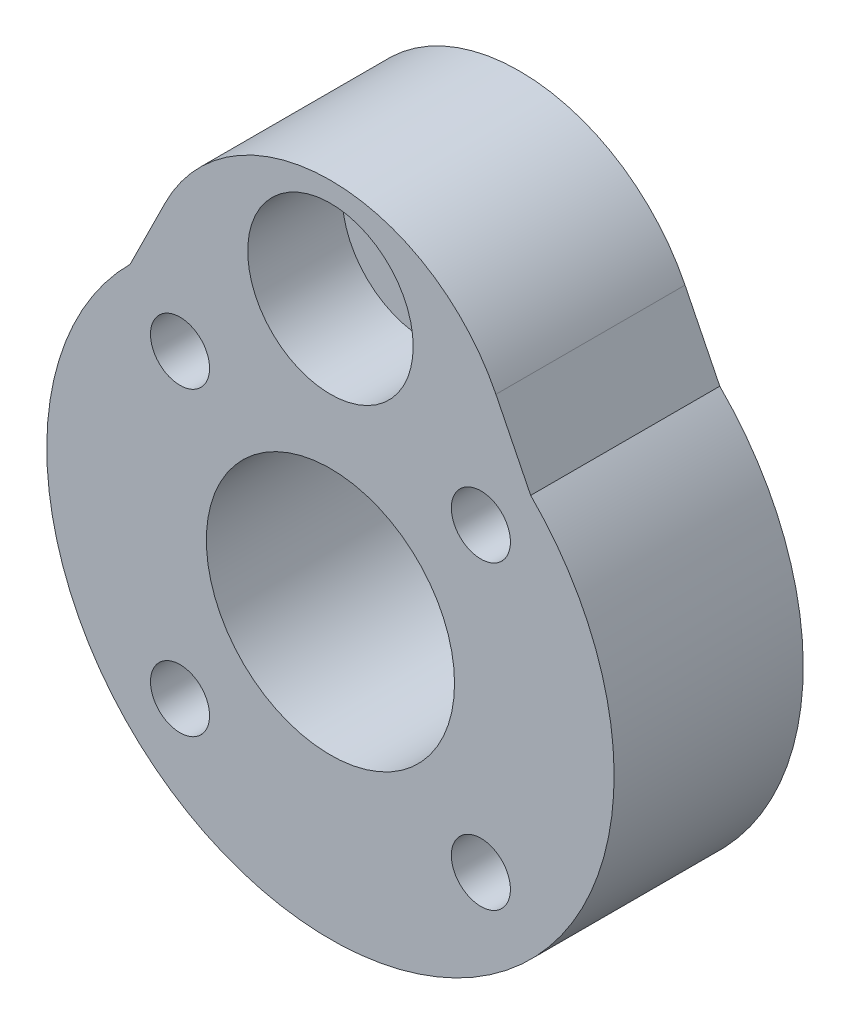
ISO-10303-21;
HEADER;
FILE_DESCRIPTION(('STEP AP214'),'2;1');
FILE_NAME('part.step','',(''),(''),'','','');
FILE_SCHEMA(('AUTOMOTIVE_DESIGN { 1 0 10303 214 1 1 1 1 }'));
ENDSEC;
DATA;
#1=APPLICATION_CONTEXT('core data for automotive mechanical design processes');
#2=APPLICATION_PROTOCOL_DEFINITION('international standard','automotive_design',2000,#1);
#3=PRODUCT_CONTEXT('',#1,'mechanical');
#4=PRODUCT('Part','Part','',(#3));
#5=PRODUCT_RELATED_PRODUCT_CATEGORY('part','',(#4));
#6=PRODUCT_DEFINITION_FORMATION('','',#4);
#7=PRODUCT_DEFINITION_CONTEXT('part definition',#1,'design');
#8=PRODUCT_DEFINITION('design','',#6,#7);
#9=PRODUCT_DEFINITION_SHAPE('','',#8);
#10=(LENGTH_UNIT() NAMED_UNIT(*) SI_UNIT(.MILLI.,.METRE.));
#11=(NAMED_UNIT(*) PLANE_ANGLE_UNIT() SI_UNIT($,.RADIAN.));
#12=(NAMED_UNIT(*) SI_UNIT($,.STERADIAN.) SOLID_ANGLE_UNIT());
#13=UNCERTAINTY_MEASURE_WITH_UNIT(LENGTH_MEASURE(1.E-05),#10,'distance_accuracy_value','');
#14=(GEOMETRIC_REPRESENTATION_CONTEXT(3) GLOBAL_UNCERTAINTY_ASSIGNED_CONTEXT((#13)) GLOBAL_UNIT_ASSIGNED_CONTEXT((#10,
#11,#12)) REPRESENTATION_CONTEXT('',''));
#15=CARTESIAN_POINT('',(0.,0.,0.));
#16=DIRECTION('',(0.,0.,1.));
#17=DIRECTION('',(1.,0.,0.));
#18=AXIS2_PLACEMENT_3D('',#15,#16,#17);
#19=CARTESIAN_POINT('',(0.,11.4681143875476,0.));
#20=DIRECTION('',(0.,0.,1.));
#21=DIRECTION('',(1.,0.,0.));
#22=AXIS2_PLACEMENT_3D('',#19,#20,#21);
#23=CYLINDRICAL_SURFACE('',#22,2.00000000000001);
#24=CARTESIAN_POINT('',(0.,11.4681143875476,0.));
#25=DIRECTION('',(0.,0.,1.));
#26=DIRECTION('',(1.,0.,0.));
#27=AXIS2_PLACEMENT_3D('',#24,#25,#26);
#28=CIRCLE('',#27,2.00000000000001);
#29=CARTESIAN_POINT('',(2.00000000000001,11.4681143875476,0.));
#30=VERTEX_POINT('',#29);
#31=EDGE_CURVE('E258',#30,#30,#28,.T.);
#32=ORIENTED_EDGE('',*,*,#31,.F.);
#33=EDGE_LOOP('',(#32));
#34=FACE_BOUND('',#33,.T.);
#35=CARTESIAN_POINT('',(0.,11.4681143875476,4.));
#36=DIRECTION('',(0.,0.,1.));
#37=DIRECTION('',(1.,0.,0.));
#38=AXIS2_PLACEMENT_3D('',#35,#36,#37);
#39=CIRCLE('',#38,2.00000000000001);
#40=CARTESIAN_POINT('',(2.00000000000001,11.4681143875476,4.));
#41=VERTEX_POINT('',#40);
#42=EDGE_CURVE('E37',#41,#41,#39,.F.);
#43=ORIENTED_EDGE('',*,*,#42,.F.);
#44=EDGE_LOOP('',(#43));
#45=FACE_BOUND('',#44,.T.);
#46=ADVANCED_FACE('F33',(#34,#45),#23,.F.);
#47=CARTESIAN_POINT('',(0.,0.,8.));
#48=DIRECTION('',(0.,0.,1.));
#49=DIRECTION('',(1.,0.,0.));
#50=AXIS2_PLACEMENT_3D('',#47,#48,#49);
#51=PLANE('',#50);
#52=CARTESIAN_POINT('',(0.,11.4681143875476,8.));
#53=DIRECTION('',(0.,0.,1.));
#54=DIRECTION('',(1.,0.,0.));
#55=AXIS2_PLACEMENT_3D('',#52,#53,#54);
#56=CIRCLE('',#55,3.5);
#57=CARTESIAN_POINT('',(3.5,11.4681143875476,8.));
#58=VERTEX_POINT('',#57);
#59=EDGE_CURVE('E291',#58,#58,#56,.T.);
#60=ORIENTED_EDGE('',*,*,#59,.F.);
#61=EDGE_LOOP('',(#60));
#62=FACE_BOUND('',#61,.T.);
#63=CARTESIAN_POINT('',(6.36396103067894,6.36396103067892,8.));
#64=DIRECTION('',(0.,0.,1.));
#65=DIRECTION('',(1.,0.,0.));
#66=AXIS2_PLACEMENT_3D('',#63,#64,#65);
#67=CIRCLE('',#66,1.25);
#68=CARTESIAN_POINT('',(7.61396103067894,6.36396103067892,8.));
#69=VERTEX_POINT('',#68);
#70=EDGE_CURVE('E286',#69,#69,#67,.T.);
#71=ORIENTED_EDGE('',*,*,#70,.F.);
#72=EDGE_LOOP('',(#71));
#73=FACE_BOUND('',#72,.T.);
#74=CARTESIAN_POINT('',(6.36396103067892,-6.36396103067894,8.));
#75=DIRECTION('',(0.,0.,1.));
#76=DIRECTION('',(1.,0.,0.));
#77=AXIS2_PLACEMENT_3D('',#74,#75,#76);
#78=CIRCLE('',#77,1.25);
#79=CARTESIAN_POINT('',(7.61396103067892,-6.36396103067894,8.));
#80=VERTEX_POINT('',#79);
#81=EDGE_CURVE('E282',#80,#80,#78,.T.);
#82=ORIENTED_EDGE('',*,*,#81,.F.);
#83=EDGE_LOOP('',(#82));
#84=FACE_BOUND('',#83,.T.);
#85=CARTESIAN_POINT('',(-6.36396103067894,-6.36396103067892,8.));
#86=DIRECTION('',(0.,0.,1.));
#87=DIRECTION('',(1.,0.,0.));
#88=AXIS2_PLACEMENT_3D('',#85,#86,#87);
#89=CIRCLE('',#88,1.25);
#90=CARTESIAN_POINT('',(-5.11396103067894,-6.36396103067892,8.));
#91=VERTEX_POINT('',#90);
#92=EDGE_CURVE('E278',#91,#91,#89,.T.);
#93=ORIENTED_EDGE('',*,*,#92,.F.);
#94=EDGE_LOOP('',(#93));
#95=FACE_BOUND('',#94,.T.);
#96=CARTESIAN_POINT('',(-6.36396103067892,6.36396103067894,8.));
#97=DIRECTION('',(0.,0.,1.));
#98=DIRECTION('',(1.,0.,0.));
#99=AXIS2_PLACEMENT_3D('',#96,#97,#98);
#100=CIRCLE('',#99,1.25);
#101=CARTESIAN_POINT('',(-5.11396103067892,6.36396103067894,8.));
#102=VERTEX_POINT('',#101);
#103=EDGE_CURVE('E97',#102,#102,#100,.T.);
#104=ORIENTED_EDGE('',*,*,#103,.F.);
#105=EDGE_LOOP('',(#104));
#106=FACE_BOUND('',#105,.T.);
#107=CARTESIAN_POINT('',(0.,0.,8.));
#108=DIRECTION('',(0.,0.,1.));
#109=DIRECTION('',(1.,0.,0.));
#110=AXIS2_PLACEMENT_3D('',#107,#108,#109);
#111=CIRCLE('',#110,12.);
#112=CARTESIAN_POINT('',(-8.47053717304872,8.49999999999999,8.));
#113=VERTEX_POINT('',#112);
#114=CARTESIAN_POINT('',(8.47053717304871,8.5,8.));
#115=VERTEX_POINT('',#114);
#116=EDGE_CURVE('E11',#113,#115,#111,.T.);
#117=ORIENTED_EDGE('',*,*,#116,.T.);
#118=DIRECTION('',(-0.44394533232071,0.896053872214531,0.));
#119=VECTOR('',#118,1.);
#120=CARTESIAN_POINT('',(7.,11.4681143875476,8.));
#121=LINE('',#120,#119);
#122=CARTESIAN_POINT('',(7.,11.4681143875476,8.));
#123=VERTEX_POINT('',#122);
#124=EDGE_CURVE('E84',#115,#123,#121,.T.);
#125=ORIENTED_EDGE('',*,*,#124,.T.);
#126=CARTESIAN_POINT('',(0.,8.,8.));
#127=DIRECTION('',(0.,0.,1.));
#128=DIRECTION('',(-1.,0.,0.));
#129=AXIS2_PLACEMENT_3D('',#126,#127,#128);
#130=CIRCLE('',#129,7.81203029980778);
#131=CARTESIAN_POINT('',(-7.,11.4681143875476,8.));
#132=VERTEX_POINT('',#131);
#133=EDGE_CURVE('E78',#123,#132,#130,.T.);
#134=ORIENTED_EDGE('',*,*,#133,.T.);
#135=DIRECTION('',(-0.44394533232071,-0.896053872214531,0.));
#136=VECTOR('',#135,1.);
#137=CARTESIAN_POINT('',(-7.,11.4681143875476,8.));
#138=LINE('',#137,#136);
#139=EDGE_CURVE('E87',#132,#113,#138,.T.);
#140=ORIENTED_EDGE('',*,*,#139,.T.);
#141=EDGE_LOOP('',(#117,#125,#134,#140));
#142=FACE_BOUND('',#141,.T.);
#143=CARTESIAN_POINT('',(0.,0.,8.));
#144=DIRECTION('',(0.,0.,1.));
#145=DIRECTION('',(1.,0.,0.));
#146=AXIS2_PLACEMENT_3D('',#143,#144,#145);
#147=CIRCLE('',#146,5.25);
#148=CARTESIAN_POINT('',(5.25,0.,8.));
#149=VERTEX_POINT('',#148);
#150=EDGE_CURVE('E112',#149,#149,#147,.T.);
#151=ORIENTED_EDGE('',*,*,#150,.F.);
#152=EDGE_LOOP('',(#151));
#153=FACE_BOUND('',#152,.T.);
#154=ADVANCED_FACE('F91',(#62,#73,#84,#95,#106,#142,#153),#51,.T.);
#155=CARTESIAN_POINT('',(0.,0.,0.));
#156=DIRECTION('',(0.,0.,1.));
#157=DIRECTION('',(1.,0.,0.));
#158=AXIS2_PLACEMENT_3D('',#155,#156,#157);
#159=PLANE('',#158);
#160=ORIENTED_EDGE('',*,*,#31,.T.);
#161=EDGE_LOOP('',(#160));
#162=FACE_BOUND('',#161,.T.);
#163=CARTESIAN_POINT('',(6.36396103067894,6.36396103067892,0.));
#164=DIRECTION('',(0.,0.,1.));
#165=DIRECTION('',(1.,0.,0.));
#166=AXIS2_PLACEMENT_3D('',#163,#164,#165);
#167=CIRCLE('',#166,1.25);
#168=CARTESIAN_POINT('',(7.61396103067894,6.36396103067892,0.));
#169=VERTEX_POINT('',#168);
#170=EDGE_CURVE('E262',#169,#169,#167,.T.);
#171=ORIENTED_EDGE('',*,*,#170,.T.);
#172=EDGE_LOOP('',(#171));
#173=FACE_BOUND('',#172,.T.);
#174=CARTESIAN_POINT('',(6.36396103067892,-6.36396103067894,0.));
#175=DIRECTION('',(0.,0.,1.));
#176=DIRECTION('',(1.,0.,0.));
#177=AXIS2_PLACEMENT_3D('',#174,#175,#176);
#178=CIRCLE('',#177,1.25);
#179=CARTESIAN_POINT('',(7.61396103067892,-6.36396103067894,0.));
#180=VERTEX_POINT('',#179);
#181=EDGE_CURVE('E266',#180,#180,#178,.T.);
#182=ORIENTED_EDGE('',*,*,#181,.T.);
#183=EDGE_LOOP('',(#182));
#184=FACE_BOUND('',#183,.T.);
#185=CARTESIAN_POINT('',(-6.36396103067894,-6.36396103067892,0.));
#186=DIRECTION('',(0.,0.,1.));
#187=DIRECTION('',(1.,0.,0.));
#188=AXIS2_PLACEMENT_3D('',#185,#186,#187);
#189=CIRCLE('',#188,1.25);
#190=CARTESIAN_POINT('',(-5.11396103067894,-6.36396103067892,0.));
#191=VERTEX_POINT('',#190);
#192=EDGE_CURVE('E270',#191,#191,#189,.T.);
#193=ORIENTED_EDGE('',*,*,#192,.T.);
#194=EDGE_LOOP('',(#193));
#195=FACE_BOUND('',#194,.T.);
#196=CARTESIAN_POINT('',(-6.36396103067892,6.36396103067894,0.));
#197=DIRECTION('',(0.,0.,1.));
#198=DIRECTION('',(1.,0.,0.));
#199=AXIS2_PLACEMENT_3D('',#196,#197,#198);
#200=CIRCLE('',#199,1.25);
#201=CARTESIAN_POINT('',(-5.11396103067892,6.36396103067894,0.));
#202=VERTEX_POINT('',#201);
#203=EDGE_CURVE('E94',#202,#202,#200,.T.);
#204=ORIENTED_EDGE('',*,*,#203,.T.);
#205=EDGE_LOOP('',(#204));
#206=FACE_BOUND('',#205,.T.);
#207=CARTESIAN_POINT('',(0.,0.,0.));
#208=DIRECTION('',(0.,0.,1.));
#209=DIRECTION('',(1.,0.,0.));
#210=AXIS2_PLACEMENT_3D('',#207,#208,#209);
#211=CIRCLE('',#210,12.);
#212=CARTESIAN_POINT('',(-8.47053717304871,8.5,0.));
#213=VERTEX_POINT('',#212);
#214=CARTESIAN_POINT('',(8.47053717304871,8.5,0.));
#215=VERTEX_POINT('',#214);
#216=EDGE_CURVE('E42',#213,#215,#211,.T.);
#217=ORIENTED_EDGE('',*,*,#216,.F.);
#218=DIRECTION('',(0.44394533232071,0.896053872214531,0.));
#219=VECTOR('',#218,1.);
#220=CARTESIAN_POINT('',(-7.,11.4681143875476,0.));
#221=LINE('',#220,#219);
#222=CARTESIAN_POINT('',(-7.,11.4681143875476,0.));
#223=VERTEX_POINT('',#222);
#224=EDGE_CURVE('E109',#213,#223,#221,.T.);
#225=ORIENTED_EDGE('',*,*,#224,.T.);
#226=CARTESIAN_POINT('',(0.,8.,0.));
#227=DIRECTION('',(0.,0.,1.));
#228=DIRECTION('',(1.,0.,0.));
#229=AXIS2_PLACEMENT_3D('',#226,#227,#228);
#230=CIRCLE('',#229,7.81203029980778);
#231=CARTESIAN_POINT('',(7.,11.4681143875476,0.));
#232=VERTEX_POINT('',#231);
#233=EDGE_CURVE('E80',#223,#232,#230,.F.);
#234=ORIENTED_EDGE('',*,*,#233,.T.);
#235=DIRECTION('',(0.44394533232071,-0.896053872214531,0.));
#236=VECTOR('',#235,1.);
#237=CARTESIAN_POINT('',(7.,11.4681143875476,0.));
#238=LINE('',#237,#236);
#239=EDGE_CURVE('E105',#232,#215,#238,.T.);
#240=ORIENTED_EDGE('',*,*,#239,.T.);
#241=EDGE_LOOP('',(#217,#225,#234,#240));
#242=FACE_BOUND('',#241,.T.);
#243=CARTESIAN_POINT('',(0.,0.,0.));
#244=DIRECTION('',(0.,0.,1.));
#245=DIRECTION('',(1.,0.,0.));
#246=AXIS2_PLACEMENT_3D('',#243,#244,#245);
#247=CIRCLE('',#246,5.25);
#248=CARTESIAN_POINT('',(5.25,0.,0.));
#249=VERTEX_POINT('',#248);
#250=EDGE_CURVE('E111',#249,#249,#247,.T.);
#251=ORIENTED_EDGE('',*,*,#250,.T.);
#252=EDGE_LOOP('',(#251));
#253=FACE_BOUND('',#252,.T.);
#254=ADVANCED_FACE('F118',(#162,#173,#184,#195,#206,#242,#253),#159,.F.);
#255=CARTESIAN_POINT('',(0.,0.,8.));
#256=DIRECTION('',(0.,0.,-1.));
#257=DIRECTION('',(-1.,0.,0.));
#258=AXIS2_PLACEMENT_3D('',#255,#256,#257);
#259=CYLINDRICAL_SURFACE('',#258,12.);
#260=ORIENTED_EDGE('',*,*,#216,.T.);
#261=DIRECTION('',(0.,0.,1.));
#262=VECTOR('',#261,1.);
#263=CARTESIAN_POINT('',(8.47053717304871,8.5,-18.4517150179951));
#264=LINE('',#263,#262);
#265=EDGE_CURVE('E106',#215,#115,#264,.T.);
#266=ORIENTED_EDGE('',*,*,#265,.T.);
#267=ORIENTED_EDGE('',*,*,#116,.F.);
#268=DIRECTION('',(0.,0.,1.));
#269=VECTOR('',#268,1.);
#270=CARTESIAN_POINT('',(-8.47053717304871,8.5,-18.4517150179951));
#271=LINE('',#270,#269);
#272=EDGE_CURVE('E83',#213,#113,#271,.T.);
#273=ORIENTED_EDGE('',*,*,#272,.F.);
#274=EDGE_LOOP('',(#260,#266,#267,#273));
#275=FACE_BOUND('',#274,.T.);
#276=ADVANCED_FACE('F35',(#275),#259,.T.);
#277=CARTESIAN_POINT('',(0.,0.,8.));
#278=DIRECTION('',(0.,0.,-1.));
#279=DIRECTION('',(-1.,0.,0.));
#280=AXIS2_PLACEMENT_3D('',#277,#278,#279);
#281=CYLINDRICAL_SURFACE('',#280,5.25);
#282=ORIENTED_EDGE('',*,*,#150,.T.);
#283=EDGE_LOOP('',(#282));
#284=FACE_BOUND('',#283,.T.);
#285=ORIENTED_EDGE('',*,*,#250,.F.);
#286=EDGE_LOOP('',(#285));
#287=FACE_BOUND('',#286,.T.);
#288=ADVANCED_FACE('F120',(#284,#287),#281,.F.);
#289=CARTESIAN_POINT('',(0.,8.,-18.4517150179951));
#290=DIRECTION('',(0.,0.,1.));
#291=DIRECTION('',(1.,0.,0.));
#292=AXIS2_PLACEMENT_3D('',#289,#290,#291);
#293=CYLINDRICAL_SURFACE('',#292,7.81203029980778);
#294=ORIENTED_EDGE('',*,*,#233,.F.);
#295=DIRECTION('',(0.,0.,1.));
#296=VECTOR('',#295,1.);
#297=CARTESIAN_POINT('',(-7.,11.4681143875476,-18.4517150179951));
#298=LINE('',#297,#296);
#299=EDGE_CURVE('E73',#223,#132,#298,.T.);
#300=ORIENTED_EDGE('',*,*,#299,.T.);
#301=ORIENTED_EDGE('',*,*,#133,.F.);
#302=DIRECTION('',(0.,0.,1.));
#303=VECTOR('',#302,1.);
#304=CARTESIAN_POINT('',(7.,11.4681143875476,-18.4517150179951));
#305=LINE('',#304,#303);
#306=EDGE_CURVE('E103',#232,#123,#305,.T.);
#307=ORIENTED_EDGE('',*,*,#306,.F.);
#308=EDGE_LOOP('',(#294,#300,#301,#307));
#309=FACE_BOUND('',#308,.T.);
#310=ADVANCED_FACE('F75',(#309),#293,.T.);
#311=CARTESIAN_POINT('',(7.,11.4681143875476,-18.4517150179951));
#312=DIRECTION('',(0.896053872214531,0.44394533232071,0.));
#313=DIRECTION('',(-0.44394533232071,0.896053872214531,0.));
#314=AXIS2_PLACEMENT_3D('',#311,#312,#313);
#315=PLANE('',#314);
#316=ORIENTED_EDGE('',*,*,#239,.F.);
#317=ORIENTED_EDGE('',*,*,#306,.T.);
#318=ORIENTED_EDGE('',*,*,#124,.F.);
#319=ORIENTED_EDGE('',*,*,#265,.F.);
#320=EDGE_LOOP('',(#316,#317,#318,#319));
#321=FACE_BOUND('',#320,.T.);
#322=ADVANCED_FACE('F128',(#321),#315,.T.);
#323=CARTESIAN_POINT('',(-7.,11.4681143875476,-18.4517150179951));
#324=DIRECTION('',(-0.896053872214531,0.44394533232071,0.));
#325=DIRECTION('',(-0.44394533232071,-0.896053872214531,0.));
#326=AXIS2_PLACEMENT_3D('',#323,#324,#325);
#327=PLANE('',#326);
#328=ORIENTED_EDGE('',*,*,#224,.F.);
#329=ORIENTED_EDGE('',*,*,#272,.T.);
#330=ORIENTED_EDGE('',*,*,#139,.F.);
#331=ORIENTED_EDGE('',*,*,#299,.F.);
#332=EDGE_LOOP('',(#328,#329,#330,#331));
#333=FACE_BOUND('',#332,.T.);
#334=ADVANCED_FACE('F88',(#333),#327,.T.);
#335=CARTESIAN_POINT('',(-6.36396103067892,6.36396103067894,0.));
#336=DIRECTION('',(0.,0.,1.));
#337=DIRECTION('',(1.,0.,0.));
#338=AXIS2_PLACEMENT_3D('',#335,#336,#337);
#339=CYLINDRICAL_SURFACE('',#338,1.25);
#340=ORIENTED_EDGE('',*,*,#203,.F.);
#341=EDGE_LOOP('',(#340));
#342=FACE_BOUND('',#341,.T.);
#343=ORIENTED_EDGE('',*,*,#103,.T.);
#344=EDGE_LOOP('',(#343));
#345=FACE_BOUND('',#344,.T.);
#346=ADVANCED_FACE('F156',(#342,#345),#339,.F.);
#347=CARTESIAN_POINT('',(-6.36396103067894,-6.36396103067892,0.));
#348=DIRECTION('',(0.,0.,1.));
#349=DIRECTION('',(1.,0.,0.));
#350=AXIS2_PLACEMENT_3D('',#347,#348,#349);
#351=CYLINDRICAL_SURFACE('',#350,1.25);
#352=ORIENTED_EDGE('',*,*,#192,.F.);
#353=EDGE_LOOP('',(#352));
#354=FACE_BOUND('',#353,.T.);
#355=ORIENTED_EDGE('',*,*,#92,.T.);
#356=EDGE_LOOP('',(#355));
#357=FACE_BOUND('',#356,.T.);
#358=ADVANCED_FACE('F152',(#354,#357),#351,.F.);
#359=CARTESIAN_POINT('',(6.36396103067892,-6.36396103067894,0.));
#360=DIRECTION('',(0.,0.,1.));
#361=DIRECTION('',(1.,0.,0.));
#362=AXIS2_PLACEMENT_3D('',#359,#360,#361);
#363=CYLINDRICAL_SURFACE('',#362,1.25);
#364=ORIENTED_EDGE('',*,*,#181,.F.);
#365=EDGE_LOOP('',(#364));
#366=FACE_BOUND('',#365,.T.);
#367=ORIENTED_EDGE('',*,*,#81,.T.);
#368=EDGE_LOOP('',(#367));
#369=FACE_BOUND('',#368,.T.);
#370=ADVANCED_FACE('F148',(#366,#369),#363,.F.);
#371=CARTESIAN_POINT('',(6.36396103067894,6.36396103067892,0.));
#372=DIRECTION('',(0.,0.,1.));
#373=DIRECTION('',(1.,0.,0.));
#374=AXIS2_PLACEMENT_3D('',#371,#372,#373);
#375=CYLINDRICAL_SURFACE('',#374,1.25);
#376=ORIENTED_EDGE('',*,*,#170,.F.);
#377=EDGE_LOOP('',(#376));
#378=FACE_BOUND('',#377,.T.);
#379=ORIENTED_EDGE('',*,*,#70,.T.);
#380=EDGE_LOOP('',(#379));
#381=FACE_BOUND('',#380,.T.);
#382=ADVANCED_FACE('F144',(#378,#381),#375,.F.);
#383=CARTESIAN_POINT('',(0.,11.4681143875476,4.));
#384=DIRECTION('',(0.,0.,1.));
#385=DIRECTION('',(1.,0.,0.));
#386=AXIS2_PLACEMENT_3D('',#383,#384,#385);
#387=PLANE('',#386);
#388=CARTESIAN_POINT('',(0.,11.4681143875476,4.));
#389=DIRECTION('',(0.,0.,1.));
#390=DIRECTION('',(1.,0.,0.));
#391=AXIS2_PLACEMENT_3D('',#388,#389,#390);
#392=CIRCLE('',#391,3.5);
#393=CARTESIAN_POINT('',(3.5,11.4681143875476,4.));
#394=VERTEX_POINT('',#393);
#395=EDGE_CURVE('E294',#394,#394,#392,.T.);
#396=ORIENTED_EDGE('',*,*,#395,.T.);
#397=EDGE_LOOP('',(#396));
#398=FACE_BOUND('',#397,.T.);
#399=ORIENTED_EDGE('',*,*,#42,.T.);
#400=EDGE_LOOP('',(#399));
#401=FACE_BOUND('',#400,.T.);
#402=ADVANCED_FACE('F147',(#398,#401),#387,.T.);
#403=CARTESIAN_POINT('',(0.,11.4681143875476,4.));
#404=DIRECTION('',(0.,0.,1.));
#405=DIRECTION('',(1.,0.,0.));
#406=AXIS2_PLACEMENT_3D('',#403,#404,#405);
#407=CYLINDRICAL_SURFACE('',#406,3.5);
#408=ORIENTED_EDGE('',*,*,#395,.F.);
#409=EDGE_LOOP('',(#408));
#410=FACE_BOUND('',#409,.T.);
#411=ORIENTED_EDGE('',*,*,#59,.T.);
#412=EDGE_LOOP('',(#411));
#413=FACE_BOUND('',#412,.T.);
#414=ADVANCED_FACE('F142',(#410,#413),#407,.F.);
#415=CLOSED_SHELL('',(#46,#154,#254,#276,#288,#310,#322,#334,#346,#358,#370,#382,#402,#414));
#416=MANIFOLD_SOLID_BREP('B2',#415);
#417=ADVANCED_BREP_SHAPE_REPRESENTATION('',(#18,#416),#14);
#418=SHAPE_DEFINITION_REPRESENTATION(#9,#417);
ENDSEC;
END-ISO-10303-21;
